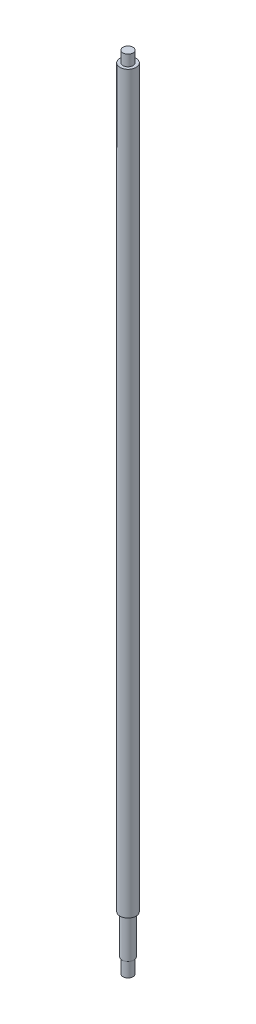
ISO-10303-21;
HEADER;
FILE_DESCRIPTION(('STEP AP214'),'2;1');
FILE_NAME('part.step','',(''),(''),'','','');
FILE_SCHEMA(('AUTOMOTIVE_DESIGN { 1 0 10303 214 1 1 1 1 }'));
ENDSEC;
DATA;
#1=APPLICATION_CONTEXT('core data for automotive mechanical design processes');
#2=APPLICATION_PROTOCOL_DEFINITION('international standard','automotive_design',2000,#1);
#3=PRODUCT_CONTEXT('',#1,'mechanical');
#4=PRODUCT('Part','Part','',(#3));
#5=PRODUCT_RELATED_PRODUCT_CATEGORY('part','',(#4));
#6=PRODUCT_DEFINITION_FORMATION('','',#4);
#7=PRODUCT_DEFINITION_CONTEXT('part definition',#1,'design');
#8=PRODUCT_DEFINITION('design','',#6,#7);
#9=PRODUCT_DEFINITION_SHAPE('','',#8);
#10=(LENGTH_UNIT() NAMED_UNIT(*) SI_UNIT(.MILLI.,.METRE.));
#11=(NAMED_UNIT(*) PLANE_ANGLE_UNIT() SI_UNIT($,.RADIAN.));
#12=(NAMED_UNIT(*) SI_UNIT($,.STERADIAN.) SOLID_ANGLE_UNIT());
#13=UNCERTAINTY_MEASURE_WITH_UNIT(LENGTH_MEASURE(1.E-05),#10,'distance_accuracy_value','');
#14=(GEOMETRIC_REPRESENTATION_CONTEXT(3) GLOBAL_UNCERTAINTY_ASSIGNED_CONTEXT((#13)) GLOBAL_UNIT_ASSIGNED_CONTEXT((#10,
#11,#12)) REPRESENTATION_CONTEXT('',''));
#15=CARTESIAN_POINT('',(0.,0.,0.));
#16=DIRECTION('',(0.,0.,1.));
#17=DIRECTION('',(1.,0.,0.));
#18=AXIS2_PLACEMENT_3D('',#15,#16,#17);
#19=CARTESIAN_POINT('',(0.,0.,0.));
#20=DIRECTION('',(0.,-1.,0.));
#21=DIRECTION('',(0.,0.,-1.));
#22=AXIS2_PLACEMENT_3D('',#19,#20,#21);
#23=PLANE('',#22);
#24=CARTESIAN_POINT('',(0.,0.,0.));
#25=DIRECTION('',(0.,-1.,0.));
#26=DIRECTION('',(0.,0.,-1.));
#27=AXIS2_PLACEMENT_3D('',#24,#25,#26);
#28=CIRCLE('',#27,5.);
#29=CARTESIAN_POINT('',(0.,0.,-5.));
#30=VERTEX_POINT('',#29);
#31=EDGE_CURVE('E10',#30,#30,#28,.T.);
#32=ORIENTED_EDGE('',*,*,#31,.T.);
#33=EDGE_LOOP('',(#32));
#34=FACE_BOUND('',#33,.T.);
#35=ADVANCED_FACE('F31',(#34),#23,.T.);
#36=CARTESIAN_POINT('',(0.,0.,0.));
#37=DIRECTION('',(0.,-1.,0.));
#38=DIRECTION('',(0.,0.,-1.));
#39=AXIS2_PLACEMENT_3D('',#36,#37,#38);
#40=CYLINDRICAL_SURFACE('',#39,5.);
#41=CARTESIAN_POINT('',(0.,15.,0.));
#42=DIRECTION('',(0.,-1.,0.));
#43=DIRECTION('',(0.,0.,-1.));
#44=AXIS2_PLACEMENT_3D('',#41,#42,#43);
#45=CIRCLE('',#44,5.);
#46=CARTESIAN_POINT('',(0.,15.,-5.));
#47=VERTEX_POINT('',#46);
#48=EDGE_CURVE('E37',#47,#47,#45,.T.);
#49=ORIENTED_EDGE('',*,*,#48,.T.);
#50=EDGE_LOOP('',(#49));
#51=FACE_BOUND('',#50,.T.);
#52=ORIENTED_EDGE('',*,*,#31,.F.);
#53=EDGE_LOOP('',(#52));
#54=FACE_BOUND('',#53,.T.);
#55=ADVANCED_FACE('F75',(#51,#54),#40,.T.);
#56=CARTESIAN_POINT('',(5.,15.,0.));
#57=DIRECTION('',(0.,-1.,0.));
#58=DIRECTION('',(0.,0.,-1.));
#59=AXIS2_PLACEMENT_3D('',#56,#57,#58);
#60=PLANE('',#59);
#61=CARTESIAN_POINT('',(0.,15.,0.));
#62=DIRECTION('',(0.,-1.,0.));
#63=DIRECTION('',(0.,0.,-1.));
#64=AXIS2_PLACEMENT_3D('',#61,#62,#63);
#65=CIRCLE('',#64,6.);
#66=CARTESIAN_POINT('',(0.,15.,-6.));
#67=VERTEX_POINT('',#66);
#68=EDGE_CURVE('E41',#67,#67,#65,.T.);
#69=ORIENTED_EDGE('',*,*,#68,.T.);
#70=EDGE_LOOP('',(#69));
#71=FACE_BOUND('',#70,.T.);
#72=ORIENTED_EDGE('',*,*,#48,.F.);
#73=EDGE_LOOP('',(#72));
#74=FACE_BOUND('',#73,.T.);
#75=ADVANCED_FACE('F79',(#71,#74),#60,.T.);
#76=CARTESIAN_POINT('',(0.,0.,0.));
#77=DIRECTION('',(0.,-1.,0.));
#78=DIRECTION('',(0.,0.,-1.));
#79=AXIS2_PLACEMENT_3D('',#76,#77,#78);
#80=CYLINDRICAL_SURFACE('',#79,6.);
#81=CARTESIAN_POINT('',(0.,54.,0.));
#82=DIRECTION('',(0.,-1.,0.));
#83=DIRECTION('',(0.,0.,-1.));
#84=AXIS2_PLACEMENT_3D('',#81,#82,#83);
#85=CIRCLE('',#84,5.99999999999999);
#86=CARTESIAN_POINT('',(0.,54.,-5.99999999999999));
#87=VERTEX_POINT('',#86);
#88=EDGE_CURVE('E45',#87,#87,#85,.T.);
#89=ORIENTED_EDGE('',*,*,#88,.T.);
#90=EDGE_LOOP('',(#89));
#91=FACE_BOUND('',#90,.T.);
#92=ORIENTED_EDGE('',*,*,#68,.F.);
#93=EDGE_LOOP('',(#92));
#94=FACE_BOUND('',#93,.T.);
#95=ADVANCED_FACE('F83',(#91,#94),#80,.T.);
#96=CARTESIAN_POINT('',(5.99999999999999,54.,0.));
#97=DIRECTION('',(0.,-1.,0.));
#98=DIRECTION('',(0.,0.,-1.));
#99=AXIS2_PLACEMENT_3D('',#96,#97,#98);
#100=PLANE('',#99);
#101=CARTESIAN_POINT('',(0.,54.,0.));
#102=DIRECTION('',(0.,-1.,0.));
#103=DIRECTION('',(0.,0.,-1.));
#104=AXIS2_PLACEMENT_3D('',#101,#102,#103);
#105=CIRCLE('',#104,8.00000000000001);
#106=CARTESIAN_POINT('',(0.,54.,-8.00000000000001));
#107=VERTEX_POINT('',#106);
#108=EDGE_CURVE('E50',#107,#107,#105,.T.);
#109=ORIENTED_EDGE('',*,*,#108,.T.);
#110=EDGE_LOOP('',(#109));
#111=FACE_BOUND('',#110,.T.);
#112=ORIENTED_EDGE('',*,*,#88,.F.);
#113=EDGE_LOOP('',(#112));
#114=FACE_BOUND('',#113,.T.);
#115=ADVANCED_FACE('F90',(#111,#114),#100,.T.);
#116=CARTESIAN_POINT('',(0.,0.,0.));
#117=DIRECTION('',(0.,-1.,0.));
#118=DIRECTION('',(0.,0.,-1.));
#119=AXIS2_PLACEMENT_3D('',#116,#117,#118);
#120=CYLINDRICAL_SURFACE('',#119,8.00000000000001);
#121=CARTESIAN_POINT('',(0.,789.,0.));
#122=DIRECTION('',(0.,-1.,0.));
#123=DIRECTION('',(0.,0.,-1.));
#124=AXIS2_PLACEMENT_3D('',#121,#122,#123);
#125=CIRCLE('',#124,8.00000000000001);
#126=CARTESIAN_POINT('',(0.,789.,-8.00000000000001));
#127=VERTEX_POINT('',#126);
#128=EDGE_CURVE('E53',#127,#127,#125,.T.);
#129=ORIENTED_EDGE('',*,*,#128,.T.);
#130=EDGE_LOOP('',(#129));
#131=FACE_BOUND('',#130,.T.);
#132=ORIENTED_EDGE('',*,*,#108,.F.);
#133=EDGE_LOOP('',(#132));
#134=FACE_BOUND('',#133,.T.);
#135=ADVANCED_FACE('F94',(#131,#134),#120,.T.);
#136=CARTESIAN_POINT('',(8.00000000000001,789.,0.));
#137=DIRECTION('',(0.,1.,0.));
#138=DIRECTION('',(0.,0.,1.));
#139=AXIS2_PLACEMENT_3D('',#136,#137,#138);
#140=PLANE('',#139);
#141=CARTESIAN_POINT('',(0.,789.,0.));
#142=DIRECTION('',(0.,-1.,0.));
#143=DIRECTION('',(0.,0.,-1.));
#144=AXIS2_PLACEMENT_3D('',#141,#142,#143);
#145=CIRCLE('',#144,5.);
#146=CARTESIAN_POINT('',(0.,789.,-5.));
#147=VERTEX_POINT('',#146);
#148=EDGE_CURVE('E56',#147,#147,#145,.T.);
#149=ORIENTED_EDGE('',*,*,#148,.T.);
#150=EDGE_LOOP('',(#149));
#151=FACE_BOUND('',#150,.T.);
#152=ORIENTED_EDGE('',*,*,#128,.F.);
#153=EDGE_LOOP('',(#152));
#154=FACE_BOUND('',#153,.T.);
#155=ADVANCED_FACE('F72',(#151,#154),#140,.T.);
#156=CARTESIAN_POINT('',(0.,0.,0.));
#157=DIRECTION('',(0.,-1.,0.));
#158=DIRECTION('',(0.,0.,-1.));
#159=AXIS2_PLACEMENT_3D('',#156,#157,#158);
#160=CYLINDRICAL_SURFACE('',#159,5.);
#161=CARTESIAN_POINT('',(0.,800.,0.));
#162=DIRECTION('',(0.,-1.,0.));
#163=DIRECTION('',(0.,0.,-1.));
#164=AXIS2_PLACEMENT_3D('',#161,#162,#163);
#165=CIRCLE('',#164,5.);
#166=CARTESIAN_POINT('',(0.,800.,-5.));
#167=VERTEX_POINT('',#166);
#168=EDGE_CURVE('E59',#167,#167,#165,.T.);
#169=ORIENTED_EDGE('',*,*,#168,.T.);
#170=EDGE_LOOP('',(#169));
#171=FACE_BOUND('',#170,.T.);
#172=ORIENTED_EDGE('',*,*,#148,.F.);
#173=EDGE_LOOP('',(#172));
#174=FACE_BOUND('',#173,.T.);
#175=ADVANCED_FACE('F63',(#171,#174),#160,.T.);
#176=CARTESIAN_POINT('',(5.,800.,0.));
#177=DIRECTION('',(0.,1.,0.));
#178=DIRECTION('',(0.,0.,1.));
#179=AXIS2_PLACEMENT_3D('',#176,#177,#178);
#180=PLANE('',#179);
#181=ORIENTED_EDGE('',*,*,#168,.F.);
#182=EDGE_LOOP('',(#181));
#183=FACE_BOUND('',#182,.T.);
#184=ADVANCED_FACE('F66',(#183),#180,.T.);
#185=CLOSED_SHELL('',(#35,#55,#75,#95,#115,#135,#155,#175,#184));
#186=MANIFOLD_SOLID_BREP('B2',#185);
#187=ADVANCED_BREP_SHAPE_REPRESENTATION('',(#18,#186),#14);
#188=SHAPE_DEFINITION_REPRESENTATION(#9,#187);
ENDSEC;
END-ISO-10303-21;
